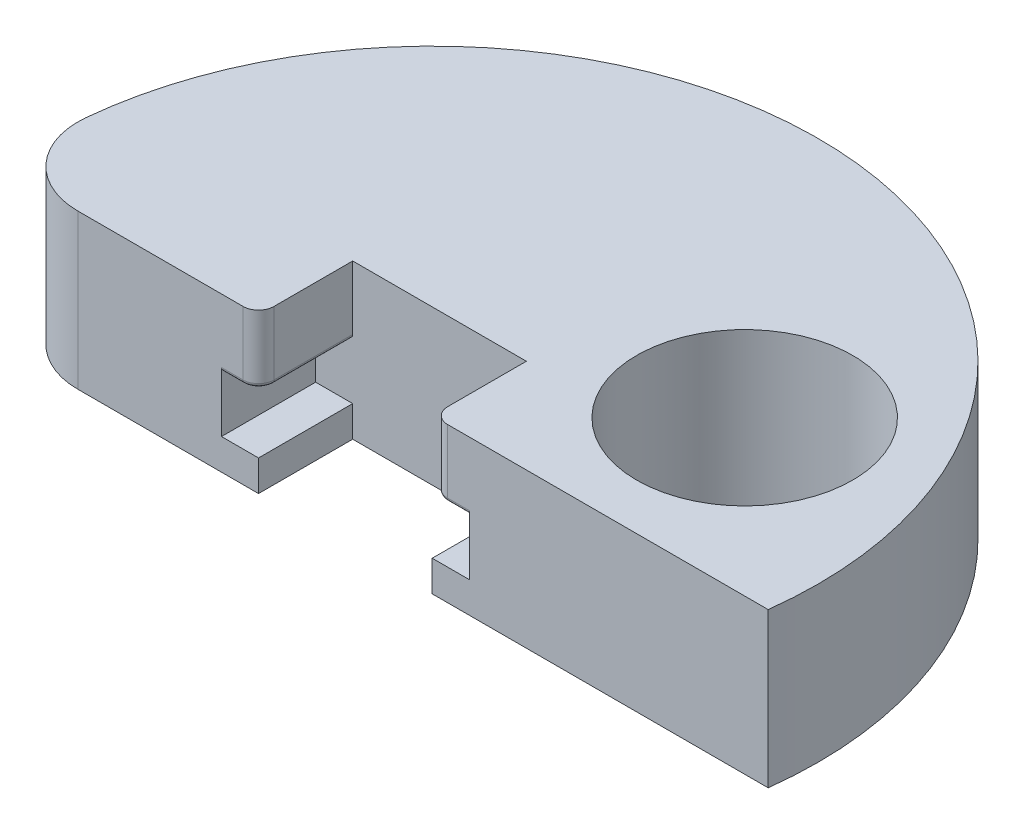
ISO-10303-21;
HEADER;
FILE_DESCRIPTION(('STEP AP214'),'2;1');
FILE_NAME('part.step','',(''),(''),'','','');
FILE_SCHEMA(('AUTOMOTIVE_DESIGN { 1 0 10303 214 1 1 1 1 }'));
ENDSEC;
DATA;
#1=APPLICATION_CONTEXT('core data for automotive mechanical design processes');
#2=APPLICATION_PROTOCOL_DEFINITION('international standard','automotive_design',2000,#1);
#3=PRODUCT_CONTEXT('',#1,'mechanical');
#4=PRODUCT('Part','Part','',(#3));
#5=PRODUCT_RELATED_PRODUCT_CATEGORY('part','',(#4));
#6=PRODUCT_DEFINITION_FORMATION('','',#4);
#7=PRODUCT_DEFINITION_CONTEXT('part definition',#1,'design');
#8=PRODUCT_DEFINITION('design','',#6,#7);
#9=PRODUCT_DEFINITION_SHAPE('','',#8);
#10=(LENGTH_UNIT() NAMED_UNIT(*) SI_UNIT(.MILLI.,.METRE.));
#11=(NAMED_UNIT(*) PLANE_ANGLE_UNIT() SI_UNIT($,.RADIAN.));
#12=(NAMED_UNIT(*) SI_UNIT($,.STERADIAN.) SOLID_ANGLE_UNIT());
#13=UNCERTAINTY_MEASURE_WITH_UNIT(LENGTH_MEASURE(1.E-05),#10,'distance_accuracy_value','');
#14=(GEOMETRIC_REPRESENTATION_CONTEXT(3) GLOBAL_UNCERTAINTY_ASSIGNED_CONTEXT((#13)) GLOBAL_UNIT_ASSIGNED_CONTEXT((#10,
#11,#12)) REPRESENTATION_CONTEXT('',''));
#15=CARTESIAN_POINT('',(0.,0.,0.));
#16=DIRECTION('',(0.,0.,1.));
#17=DIRECTION('',(1.,0.,0.));
#18=AXIS2_PLACEMENT_3D('',#15,#16,#17);
#19=CARTESIAN_POINT('',(-21.2,20.,6.09999999999998));
#20=DIRECTION('',(0.,0.,-1.));
#21=DIRECTION('',(-1.,0.,0.));
#22=AXIS2_PLACEMENT_3D('',#19,#20,#21);
#23=PLANE('',#22);
#24=DIRECTION('',(0.,-1.,0.));
#25=VECTOR('',#24,1.);
#26=CARTESIAN_POINT('',(8.1,20.,6.09999999999998));
#27=LINE('',#26,#25);
#28=CARTESIAN_POINT('',(8.1,20.,6.09999999999998));
#29=VERTEX_POINT('',#28);
#30=CARTESIAN_POINT('',(8.1,11.75,6.09999999999998));
#31=VERTEX_POINT('',#30);
#32=EDGE_CURVE('E354',#29,#31,#27,.T.);
#33=ORIENTED_EDGE('',*,*,#32,.T.);
#34=DIRECTION('',(-1.,0.,0.));
#35=VECTOR('',#34,1.);
#36=CARTESIAN_POINT('',(10.9,11.75,6.09999999999998));
#37=LINE('',#36,#35);
#38=CARTESIAN_POINT('',(10.9,11.75,6.09999999999998));
#39=VERTEX_POINT('',#38);
#40=EDGE_CURVE('E386',#31,#39,#37,.F.);
#41=ORIENTED_EDGE('',*,*,#40,.T.);
#42=DIRECTION('',(0.,-1.,0.));
#43=VECTOR('',#42,1.);
#44=CARTESIAN_POINT('',(10.9,11.25,6.09999999999998));
#45=LINE('',#44,#43);
#46=CARTESIAN_POINT('',(10.9,4.,6.09999999999998));
#47=VERTEX_POINT('',#46);
#48=EDGE_CURVE('E209',#39,#47,#45,.T.);
#49=ORIENTED_EDGE('',*,*,#48,.T.);
#50=DIRECTION('',(-1.,0.,0.));
#51=VECTOR('',#50,1.);
#52=CARTESIAN_POINT('',(6.1,4.,6.09999999999998));
#53=LINE('',#52,#51);
#54=CARTESIAN_POINT('',(6.1,4.,6.09999999999998));
#55=VERTEX_POINT('',#54);
#56=EDGE_CURVE('E203',#47,#55,#53,.T.);
#57=ORIENTED_EDGE('',*,*,#56,.T.);
#58=DIRECTION('',(0.,-1.,0.));
#59=VECTOR('',#58,1.);
#60=CARTESIAN_POINT('',(6.1,4.,6.09999999999998));
#61=LINE('',#60,#59);
#62=CARTESIAN_POINT('',(6.1,0.,6.09999999999998));
#63=VERTEX_POINT('',#62);
#64=EDGE_CURVE('E185',#55,#63,#61,.T.);
#65=ORIENTED_EDGE('',*,*,#64,.T.);
#66=DIRECTION('',(1.,0.,0.));
#67=VECTOR('',#66,1.);
#68=CARTESIAN_POINT('',(10.9,0.,6.09999999999998));
#69=LINE('',#68,#67);
#70=CARTESIAN_POINT('',(49.6265050149615,0.,6.09999999999998));
#71=VERTEX_POINT('',#70);
#72=EDGE_CURVE('E261',#63,#71,#69,.T.);
#73=ORIENTED_EDGE('',*,*,#72,.T.);
#74=DIRECTION('',(0.,-1.,0.));
#75=VECTOR('',#74,1.);
#76=CARTESIAN_POINT('',(49.6265050149615,20.,6.09999999999998));
#77=LINE('',#76,#75);
#78=CARTESIAN_POINT('',(49.6265050149615,20.,6.09999999999998));
#79=VERTEX_POINT('',#78);
#80=EDGE_CURVE('E260',#79,#71,#77,.T.);
#81=ORIENTED_EDGE('',*,*,#80,.F.);
#82=DIRECTION('',(1.,0.,0.));
#83=VECTOR('',#82,1.);
#84=CARTESIAN_POINT('',(-21.2,20.,6.09999999999998));
#85=LINE('',#84,#83);
#86=EDGE_CURVE('E327',#29,#79,#85,.T.);
#87=ORIENTED_EDGE('',*,*,#86,.F.);
#88=EDGE_LOOP('',(#33,#41,#49,#57,#65,#73,#81,#87));
#89=FACE_BOUND('',#88,.T.);
#90=ADVANCED_FACE('F40',(#89),#23,.F.);
#91=CARTESIAN_POINT('',(6.1,20.,6.09999999999997));
#92=DIRECTION('',(1.,0.,0.));
#93=DIRECTION('',(0.,0.,-1.));
#94=AXIS2_PLACEMENT_3D('',#91,#92,#93);
#95=PLANE('',#94);
#96=DIRECTION('',(0.,-1.,0.));
#97=VECTOR('',#96,1.);
#98=CARTESIAN_POINT('',(6.1,20.,-6.10000000000003));
#99=LINE('',#98,#97);
#100=CARTESIAN_POINT('',(6.1,20.,-6.10000000000003));
#101=VERTEX_POINT('',#100);
#102=CARTESIAN_POINT('',(6.1,11.75,-6.10000000000003));
#103=VERTEX_POINT('',#102);
#104=EDGE_CURVE('E323',#101,#103,#99,.T.);
#105=ORIENTED_EDGE('',*,*,#104,.T.);
#106=DIRECTION('',(0.,0.,-1.));
#107=VECTOR('',#106,1.);
#108=CARTESIAN_POINT('',(6.1,11.75,4.09999999999998));
#109=LINE('',#108,#107);
#110=CARTESIAN_POINT('',(6.1,11.75,4.09999999999998));
#111=VERTEX_POINT('',#110);
#112=EDGE_CURVE('E395',#103,#111,#109,.F.);
#113=ORIENTED_EDGE('',*,*,#112,.T.);
#114=DIRECTION('',(0.,-1.,0.));
#115=VECTOR('',#114,1.);
#116=CARTESIAN_POINT('',(6.1,20.,4.09999999999998));
#117=LINE('',#116,#115);
#118=CARTESIAN_POINT('',(6.1,20.,4.09999999999998));
#119=VERTEX_POINT('',#118);
#120=EDGE_CURVE('E357',#111,#119,#117,.F.);
#121=ORIENTED_EDGE('',*,*,#120,.T.);
#122=DIRECTION('',(0.,0.,1.));
#123=VECTOR('',#122,1.);
#124=CARTESIAN_POINT('',(6.1,20.,6.09999999999997));
#125=LINE('',#124,#123);
#126=EDGE_CURVE('E316',#101,#119,#125,.T.);
#127=ORIENTED_EDGE('',*,*,#126,.F.);
#128=EDGE_LOOP('',(#105,#113,#121,#127));
#129=FACE_BOUND('',#128,.T.);
#130=ADVANCED_FACE('F453',(#129),#95,.F.);
#131=CARTESIAN_POINT('',(-39.8094209955382,20.,6.09999999999998));
#132=VERTEX_POINT('',#131);
#133=CARTESIAN_POINT('',(-18.4,20.,6.09999999999998));
#134=VERTEX_POINT('',#133);
#135=EDGE_CURVE('E331',#132,#134,#85,.T.);
#136=ORIENTED_EDGE('',*,*,#135,.F.);
#137=DIRECTION('',(0.,-1.,0.));
#138=VECTOR('',#137,1.);
#139=CARTESIAN_POINT('',(-39.8094209955382,20.,6.09999999999998));
#140=LINE('',#139,#138);
#141=CARTESIAN_POINT('',(-39.8094209955382,0.,6.09999999999998));
#142=VERTEX_POINT('',#141);
#143=EDGE_CURVE('E411',#132,#142,#140,.T.);
#144=ORIENTED_EDGE('',*,*,#143,.T.);
#145=CARTESIAN_POINT('',(-16.4,0.,6.09999999999998));
#146=VERTEX_POINT('',#145);
#147=EDGE_CURVE('E257',#142,#146,#69,.T.);
#148=ORIENTED_EDGE('',*,*,#147,.T.);
#149=DIRECTION('',(0.,-1.,0.));
#150=VECTOR('',#149,1.);
#151=CARTESIAN_POINT('',(-16.4,4.,6.09999999999998));
#152=LINE('',#151,#150);
#153=CARTESIAN_POINT('',(-16.4,4.,6.09999999999998));
#154=VERTEX_POINT('',#153);
#155=EDGE_CURVE('E241',#154,#146,#152,.T.);
#156=ORIENTED_EDGE('',*,*,#155,.F.);
#157=DIRECTION('',(-1.,0.,0.));
#158=VECTOR('',#157,1.);
#159=CARTESIAN_POINT('',(-21.2,4.,6.09999999999996));
#160=LINE('',#159,#158);
#161=CARTESIAN_POINT('',(-21.2,4.,6.09999999999998));
#162=VERTEX_POINT('',#161);
#163=EDGE_CURVE('E233',#154,#162,#160,.T.);
#164=ORIENTED_EDGE('',*,*,#163,.T.);
#165=DIRECTION('',(0.,-1.,0.));
#166=VECTOR('',#165,1.);
#167=CARTESIAN_POINT('',(-21.2,20.,6.09999999999998));
#168=LINE('',#167,#166);
#169=CARTESIAN_POINT('',(-21.2,11.75,6.09999999999998));
#170=VERTEX_POINT('',#169);
#171=EDGE_CURVE('E265',#170,#162,#168,.T.);
#172=ORIENTED_EDGE('',*,*,#171,.F.);
#173=DIRECTION('',(-1.,0.,0.));
#174=VECTOR('',#173,1.);
#175=CARTESIAN_POINT('',(-21.2,11.75,6.09999999999998));
#176=LINE('',#175,#174);
#177=CARTESIAN_POINT('',(-18.4,11.75,6.09999999999998));
#178=VERTEX_POINT('',#177);
#179=EDGE_CURVE('E370',#170,#178,#176,.F.);
#180=ORIENTED_EDGE('',*,*,#179,.T.);
#181=DIRECTION('',(0.,-1.,0.));
#182=VECTOR('',#181,1.);
#183=CARTESIAN_POINT('',(-18.4,20.,6.09999999999998));
#184=LINE('',#183,#182);
#185=EDGE_CURVE('E344',#178,#134,#184,.F.);
#186=ORIENTED_EDGE('',*,*,#185,.T.);
#187=EDGE_LOOP('',(#136,#144,#148,#156,#164,#172,#180,#186));
#188=FACE_BOUND('',#187,.T.);
#189=ADVANCED_FACE('F455',(#188),#23,.F.);
#190=CARTESIAN_POINT('',(0.,20.,0.));
#191=DIRECTION('',(0.,-1.,0.));
#192=DIRECTION('',(0.,0.,-1.));
#193=AXIS2_PLACEMENT_3D('',#190,#191,#192);
#194=CYLINDRICAL_SURFACE('',#193,50.);
#195=CARTESIAN_POINT('',(0.,0.,0.));
#196=DIRECTION('',(0.,1.,0.));
#197=DIRECTION('',(0.,0.,1.));
#198=AXIS2_PLACEMENT_3D('',#195,#196,#197);
#199=CIRCLE('',#198,50.);
#200=CARTESIAN_POINT('',(-49.7617762444228,0.,-4.87500000000003));
#201=VERTEX_POINT('',#200);
#202=EDGE_CURVE('E334',#71,#201,#199,.T.);
#203=ORIENTED_EDGE('',*,*,#202,.T.);
#204=DIRECTION('',(0.,-1.,0.));
#205=VECTOR('',#204,1.);
#206=CARTESIAN_POINT('',(-49.7617762444228,20.,-4.87500000000003));
#207=LINE('',#206,#205);
#208=CARTESIAN_POINT('',(-49.7617762444228,20.,-4.87500000000003));
#209=VERTEX_POINT('',#208);
#210=EDGE_CURVE('E49',#201,#209,#207,.F.);
#211=ORIENTED_EDGE('',*,*,#210,.T.);
#212=CARTESIAN_POINT('',(0.,20.,0.));
#213=DIRECTION('',(0.,1.,0.));
#214=DIRECTION('',(0.,0.,1.));
#215=AXIS2_PLACEMENT_3D('',#212,#213,#214);
#216=CIRCLE('',#215,50.);
#217=EDGE_CURVE('E335',#79,#209,#216,.T.);
#218=ORIENTED_EDGE('',*,*,#217,.F.);
#219=ORIENTED_EDGE('',*,*,#80,.T.);
#220=EDGE_LOOP('',(#203,#211,#218,#219));
#221=FACE_BOUND('',#220,.T.);
#222=ADVANCED_FACE('F435',(#221),#194,.T.);
#223=CARTESIAN_POINT('',(0.,20.,0.));
#224=DIRECTION('',(0.,1.,0.));
#225=DIRECTION('',(0.,0.,1.));
#226=AXIS2_PLACEMENT_3D('',#223,#224,#225);
#227=PLANE('',#226);
#228=CARTESIAN_POINT('',(26.5855223759098,20.,-13.9));
#229=DIRECTION('',(0.,1.,0.));
#230=DIRECTION('',(0.,0.,1.));
#231=AXIS2_PLACEMENT_3D('',#228,#229,#230);
#232=CIRCLE('',#231,14.);
#233=CARTESIAN_POINT('',(26.5855223759098,20.,0.0999999999999873));
#234=VERTEX_POINT('',#233);
#235=EDGE_CURVE('E245',#234,#234,#232,.T.);
#236=ORIENTED_EDGE('',*,*,#235,.F.);
#237=EDGE_LOOP('',(#236));
#238=FACE_BOUND('',#237,.T.);
#239=ORIENTED_EDGE('',*,*,#217,.T.);
#240=CARTESIAN_POINT('',(-39.8094209955382,20.,-3.90000000000002));
#241=DIRECTION('',(0.,1.,0.));
#242=DIRECTION('',(0.,0.,1.));
#243=AXIS2_PLACEMENT_3D('',#240,#241,#242);
#244=CIRCLE('',#243,10.);
#245=EDGE_CURVE('E11',#209,#132,#244,.T.);
#246=ORIENTED_EDGE('',*,*,#245,.T.);
#247=ORIENTED_EDGE('',*,*,#135,.T.);
#248=CARTESIAN_POINT('',(-18.4,20.,4.09999999999998));
#249=DIRECTION('',(0.,1.,0.));
#250=DIRECTION('',(0.,0.,1.));
#251=AXIS2_PLACEMENT_3D('',#248,#249,#250);
#252=CIRCLE('',#251,2.);
#253=CARTESIAN_POINT('',(-16.4,20.,4.09999999999998));
#254=VERTEX_POINT('',#253);
#255=EDGE_CURVE('E351',#134,#254,#252,.T.);
#256=ORIENTED_EDGE('',*,*,#255,.T.);
#257=DIRECTION('',(0.,0.,-1.));
#258=VECTOR('',#257,1.);
#259=CARTESIAN_POINT('',(-16.4,20.,6.09999999999997));
#260=LINE('',#259,#258);
#261=CARTESIAN_POINT('',(-16.4,20.,-6.10000000000003));
#262=VERTEX_POINT('',#261);
#263=EDGE_CURVE('E309',#254,#262,#260,.T.);
#264=ORIENTED_EDGE('',*,*,#263,.T.);
#265=DIRECTION('',(1.,0.,0.));
#266=VECTOR('',#265,1.);
#267=CARTESIAN_POINT('',(6.1,20.,-6.10000000000003));
#268=LINE('',#267,#266);
#269=EDGE_CURVE('E312',#262,#101,#268,.T.);
#270=ORIENTED_EDGE('',*,*,#269,.T.);
#271=ORIENTED_EDGE('',*,*,#126,.T.);
#272=CARTESIAN_POINT('',(8.1,20.,4.09999999999998));
#273=DIRECTION('',(0.,1.,0.));
#274=DIRECTION('',(0.,0.,1.));
#275=AXIS2_PLACEMENT_3D('',#272,#273,#274);
#276=CIRCLE('',#275,2.);
#277=EDGE_CURVE('E348',#119,#29,#276,.T.);
#278=ORIENTED_EDGE('',*,*,#277,.T.);
#279=ORIENTED_EDGE('',*,*,#86,.T.);
#280=EDGE_LOOP('',(#239,#246,#247,#256,#264,#270,#271,#278,#279));
#281=FACE_BOUND('',#280,.T.);
#282=ADVANCED_FACE('F439',(#238,#281),#227,.T.);
#283=CARTESIAN_POINT('',(0.,0.,0.));
#284=DIRECTION('',(0.,1.,0.));
#285=DIRECTION('',(0.,0.,1.));
#286=AXIS2_PLACEMENT_3D('',#283,#284,#285);
#287=PLANE('',#286);
#288=CARTESIAN_POINT('',(26.5855223759098,0.,-13.9));
#289=DIRECTION('',(0.,1.,0.));
#290=DIRECTION('',(0.,0.,1.));
#291=AXIS2_PLACEMENT_3D('',#288,#289,#290);
#292=CIRCLE('',#291,14.);
#293=CARTESIAN_POINT('',(26.5855223759098,0.,0.0999999999999873));
#294=VERTEX_POINT('',#293);
#295=EDGE_CURVE('E249',#294,#294,#292,.T.);
#296=ORIENTED_EDGE('',*,*,#295,.T.);
#297=EDGE_LOOP('',(#296));
#298=FACE_BOUND('',#297,.T.);
#299=ORIENTED_EDGE('',*,*,#147,.F.);
#300=CARTESIAN_POINT('',(-39.8094209955382,0.,-3.90000000000002));
#301=DIRECTION('',(0.,1.,0.));
#302=DIRECTION('',(0.,0.,1.));
#303=AXIS2_PLACEMENT_3D('',#300,#301,#302);
#304=CIRCLE('',#303,10.);
#305=EDGE_CURVE('E63',#142,#201,#304,.F.);
#306=ORIENTED_EDGE('',*,*,#305,.T.);
#307=ORIENTED_EDGE('',*,*,#202,.F.);
#308=ORIENTED_EDGE('',*,*,#72,.F.);
#309=DIRECTION('',(0.,0.,-1.));
#310=VECTOR('',#309,1.);
#311=CARTESIAN_POINT('',(6.1,0.,-6.10000000000002));
#312=LINE('',#311,#310);
#313=CARTESIAN_POINT('',(6.1,0.,-6.10000000000003));
#314=VERTEX_POINT('',#313);
#315=EDGE_CURVE('E192',#63,#314,#312,.T.);
#316=ORIENTED_EDGE('',*,*,#315,.T.);
#317=DIRECTION('',(1.,0.,0.));
#318=VECTOR('',#317,1.);
#319=CARTESIAN_POINT('',(6.1,0.,-6.10000000000003));
#320=LINE('',#319,#318);
#321=CARTESIAN_POINT('',(-16.4,0.,-6.10000000000002));
#322=VERTEX_POINT('',#321);
#323=EDGE_CURVE('E296',#322,#314,#320,.T.);
#324=ORIENTED_EDGE('',*,*,#323,.F.);
#325=DIRECTION('',(0.,0.,1.));
#326=VECTOR('',#325,1.);
#327=CARTESIAN_POINT('',(-16.4,0.,6.09999999999998));
#328=LINE('',#327,#326);
#329=EDGE_CURVE('E221',#322,#146,#328,.T.);
#330=ORIENTED_EDGE('',*,*,#329,.T.);
#331=EDGE_LOOP('',(#299,#306,#307,#308,#316,#324,#330));
#332=FACE_BOUND('',#331,.T.);
#333=ADVANCED_FACE('F436',(#298,#332),#287,.F.);
#334=CARTESIAN_POINT('',(-21.2,20.,6.09999999999998));
#335=DIRECTION('',(-1.,0.,0.));
#336=DIRECTION('',(0.,0.,1.));
#337=AXIS2_PLACEMENT_3D('',#334,#335,#336);
#338=PLANE('',#337);
#339=ORIENTED_EDGE('',*,*,#171,.T.);
#340=DIRECTION('',(0.,0.,-1.));
#341=VECTOR('',#340,1.);
#342=CARTESIAN_POINT('',(-21.2,4.,-6.10000000000002));
#343=LINE('',#342,#341);
#344=CARTESIAN_POINT('',(-21.2,4.,-6.10000000000002));
#345=VERTEX_POINT('',#344);
#346=EDGE_CURVE('E223',#162,#345,#343,.T.);
#347=ORIENTED_EDGE('',*,*,#346,.T.);
#348=DIRECTION('',(0.,-1.,0.));
#349=VECTOR('',#348,1.);
#350=CARTESIAN_POINT('',(-21.2,11.25,-6.10000000000002));
#351=LINE('',#350,#349);
#352=CARTESIAN_POINT('',(-21.2,11.25,-6.10000000000002));
#353=VERTEX_POINT('',#352);
#354=EDGE_CURVE('E292',#353,#345,#351,.T.);
#355=ORIENTED_EDGE('',*,*,#354,.F.);
#356=DIRECTION('',(0.,0.,-1.));
#357=VECTOR('',#356,1.);
#358=CARTESIAN_POINT('',(-21.2,11.25,6.09999999999998));
#359=LINE('',#358,#357);
#360=CARTESIAN_POINT('',(-21.2,11.25,5.59999999999998));
#361=VERTEX_POINT('',#360);
#362=EDGE_CURVE('E285',#361,#353,#359,.T.);
#363=ORIENTED_EDGE('',*,*,#362,.F.);
#364=CARTESIAN_POINT('',(-21.2,11.75,5.59999999999998));
#365=DIRECTION('',(-1.,0.,0.));
#366=DIRECTION('',(0.,0.,1.));
#367=AXIS2_PLACEMENT_3D('',#364,#365,#366);
#368=CIRCLE('',#367,0.5);
#369=EDGE_CURVE('E398',#361,#170,#368,.T.);
#370=ORIENTED_EDGE('',*,*,#369,.T.);
#371=EDGE_LOOP('',(#339,#347,#355,#363,#370));
#372=FACE_BOUND('',#371,.T.);
#373=ADVANCED_FACE('F438',(#372),#338,.F.);
#374=CARTESIAN_POINT('',(-16.4,20.,6.09999999999997));
#375=DIRECTION('',(-1.,0.,0.));
#376=DIRECTION('',(0.,0.,1.));
#377=AXIS2_PLACEMENT_3D('',#374,#375,#376);
#378=PLANE('',#377);
#379=DIRECTION('',(0.,-1.,0.));
#380=VECTOR('',#379,1.);
#381=CARTESIAN_POINT('',(-16.4,20.,4.09999999999998));
#382=LINE('',#381,#380);
#383=CARTESIAN_POINT('',(-16.4,11.75,4.09999999999998));
#384=VERTEX_POINT('',#383);
#385=EDGE_CURVE('E338',#254,#384,#382,.T.);
#386=ORIENTED_EDGE('',*,*,#385,.T.);
#387=DIRECTION('',(0.,0.,1.));
#388=VECTOR('',#387,1.);
#389=CARTESIAN_POINT('',(-16.4,11.75,6.09999999999997));
#390=LINE('',#389,#388);
#391=CARTESIAN_POINT('',(-16.4,11.75,-6.10000000000003));
#392=VERTEX_POINT('',#391);
#393=EDGE_CURVE('E392',#384,#392,#390,.F.);
#394=ORIENTED_EDGE('',*,*,#393,.T.);
#395=DIRECTION('',(0.,-1.,0.));
#396=VECTOR('',#395,1.);
#397=CARTESIAN_POINT('',(-16.4,20.,-6.10000000000003));
#398=LINE('',#397,#396);
#399=EDGE_CURVE('E320',#262,#392,#398,.T.);
#400=ORIENTED_EDGE('',*,*,#399,.F.);
#401=ORIENTED_EDGE('',*,*,#263,.F.);
#402=EDGE_LOOP('',(#386,#394,#400,#401));
#403=FACE_BOUND('',#402,.T.);
#404=ADVANCED_FACE('F446',(#403),#378,.F.);
#405=CARTESIAN_POINT('',(6.1,20.,-6.10000000000003));
#406=DIRECTION('',(0.,0.,-1.));
#407=DIRECTION('',(-1.,0.,0.));
#408=AXIS2_PLACEMENT_3D('',#405,#406,#407);
#409=PLANE('',#408);
#410=ORIENTED_EDGE('',*,*,#323,.T.);
#411=DIRECTION('',(0.,-1.,0.));
#412=VECTOR('',#411,1.);
#413=CARTESIAN_POINT('',(6.1,4.,-6.10000000000002));
#414=LINE('',#413,#412);
#415=CARTESIAN_POINT('',(6.1,4.,-6.10000000000003));
#416=VERTEX_POINT('',#415);
#417=EDGE_CURVE('E196',#416,#314,#414,.T.);
#418=ORIENTED_EDGE('',*,*,#417,.F.);
#419=DIRECTION('',(1.,0.,0.));
#420=VECTOR('',#419,1.);
#421=CARTESIAN_POINT('',(10.9,4.,-6.10000000000002));
#422=LINE('',#421,#420);
#423=CARTESIAN_POINT('',(10.9,4.,-6.10000000000002));
#424=VERTEX_POINT('',#423);
#425=EDGE_CURVE('E197',#416,#424,#422,.T.);
#426=ORIENTED_EDGE('',*,*,#425,.T.);
#427=DIRECTION('',(0.,-1.,0.));
#428=VECTOR('',#427,1.);
#429=CARTESIAN_POINT('',(10.9,11.25,-6.10000000000002));
#430=LINE('',#429,#428);
#431=CARTESIAN_POINT('',(10.9,11.25,-6.10000000000002));
#432=VERTEX_POINT('',#431);
#433=EDGE_CURVE('E303',#432,#424,#430,.T.);
#434=ORIENTED_EDGE('',*,*,#433,.F.);
#435=DIRECTION('',(1.,0.,0.));
#436=VECTOR('',#435,1.);
#437=CARTESIAN_POINT('',(6.1,11.25,-6.10000000000002));
#438=LINE('',#437,#436);
#439=CARTESIAN_POINT('',(6.6,11.25,-6.10000000000002));
#440=VERTEX_POINT('',#439);
#441=EDGE_CURVE('E273',#440,#432,#438,.T.);
#442=ORIENTED_EDGE('',*,*,#441,.F.);
#443=CARTESIAN_POINT('',(6.6,11.75,-6.10000000000003));
#444=DIRECTION('',(0.,0.,-1.));
#445=DIRECTION('',(-1.,0.,0.));
#446=AXIS2_PLACEMENT_3D('',#443,#444,#445);
#447=CIRCLE('',#446,0.5);
#448=EDGE_CURVE('E408',#440,#103,#447,.T.);
#449=ORIENTED_EDGE('',*,*,#448,.T.);
#450=ORIENTED_EDGE('',*,*,#104,.F.);
#451=ORIENTED_EDGE('',*,*,#269,.F.);
#452=ORIENTED_EDGE('',*,*,#399,.T.);
#453=CARTESIAN_POINT('',(-16.9,11.75,-6.10000000000003));
#454=DIRECTION('',(0.,0.,-1.));
#455=DIRECTION('',(-1.,0.,0.));
#456=AXIS2_PLACEMENT_3D('',#453,#454,#455);
#457=CIRCLE('',#456,0.5);
#458=CARTESIAN_POINT('',(-16.9,11.25,-6.10000000000003));
#459=VERTEX_POINT('',#458);
#460=EDGE_CURVE('E405',#392,#459,#457,.T.);
#461=ORIENTED_EDGE('',*,*,#460,.T.);
#462=DIRECTION('',(1.,0.,0.));
#463=VECTOR('',#462,1.);
#464=CARTESIAN_POINT('',(-16.4,11.25,-6.10000000000003));
#465=LINE('',#464,#463);
#466=EDGE_CURVE('E288',#353,#459,#465,.T.);
#467=ORIENTED_EDGE('',*,*,#466,.F.);
#468=ORIENTED_EDGE('',*,*,#354,.T.);
#469=DIRECTION('',(1.,0.,0.));
#470=VECTOR('',#469,1.);
#471=CARTESIAN_POINT('',(-21.2,4.,-6.10000000000002));
#472=LINE('',#471,#470);
#473=CARTESIAN_POINT('',(-16.4,4.,-6.10000000000003));
#474=VERTEX_POINT('',#473);
#475=EDGE_CURVE('E226',#345,#474,#472,.T.);
#476=ORIENTED_EDGE('',*,*,#475,.T.);
#477=DIRECTION('',(0.,-1.,0.));
#478=VECTOR('',#477,1.);
#479=CARTESIAN_POINT('',(-16.4,4.,-6.10000000000002));
#480=LINE('',#479,#478);
#481=EDGE_CURVE('E237',#474,#322,#480,.T.);
#482=ORIENTED_EDGE('',*,*,#481,.T.);
#483=EDGE_LOOP('',(#410,#418,#426,#434,#442,#449,#450,#451,#452,#461,#467,#468,#476,#482));
#484=FACE_BOUND('',#483,.T.);
#485=ADVANCED_FACE('F499',(#484),#409,.F.);
#486=CARTESIAN_POINT('',(10.9,11.25,-6.10000000000002));
#487=DIRECTION('',(1.,0.,0.));
#488=DIRECTION('',(0.,0.,-1.));
#489=AXIS2_PLACEMENT_3D('',#486,#487,#488);
#490=PLANE('',#489);
#491=ORIENTED_EDGE('',*,*,#433,.T.);
#492=DIRECTION('',(0.,0.,1.));
#493=VECTOR('',#492,1.);
#494=CARTESIAN_POINT('',(10.9,4.,6.09999999999998));
#495=LINE('',#494,#493);
#496=EDGE_CURVE('E211',#424,#47,#495,.T.);
#497=ORIENTED_EDGE('',*,*,#496,.T.);
#498=ORIENTED_EDGE('',*,*,#48,.F.);
#499=CARTESIAN_POINT('',(10.9,11.75,5.59999999999998));
#500=DIRECTION('',(1.,0.,0.));
#501=DIRECTION('',(0.,0.,-1.));
#502=AXIS2_PLACEMENT_3D('',#499,#500,#501);
#503=CIRCLE('',#502,0.5);
#504=CARTESIAN_POINT('',(10.9,11.25,5.59999999999998));
#505=VERTEX_POINT('',#504);
#506=EDGE_CURVE('E402',#39,#505,#503,.T.);
#507=ORIENTED_EDGE('',*,*,#506,.T.);
#508=DIRECTION('',(0.,0.,1.));
#509=VECTOR('',#508,1.);
#510=CARTESIAN_POINT('',(10.9,11.25,-6.10000000000002));
#511=LINE('',#510,#509);
#512=EDGE_CURVE('E299',#432,#505,#511,.T.);
#513=ORIENTED_EDGE('',*,*,#512,.F.);
#514=EDGE_LOOP('',(#491,#497,#498,#507,#513));
#515=FACE_BOUND('',#514,.T.);
#516=ADVANCED_FACE('F491',(#515),#490,.F.);
#517=CARTESIAN_POINT('',(0.,11.25,0.));
#518=DIRECTION('',(0.,-1.,0.));
#519=DIRECTION('',(0.,0.,-1.));
#520=AXIS2_PLACEMENT_3D('',#517,#518,#519);
#521=PLANE('',#520);
#522=CARTESIAN_POINT('',(8.75,11.25,0.));
#523=DIRECTION('',(0.,-1.,0.));
#524=DIRECTION('',(0.,0.,-1.));
#525=AXIS2_PLACEMENT_3D('',#522,#523,#524);
#526=CIRCLE('',#525,0.500000000000001);
#527=CARTESIAN_POINT('',(8.75,11.25,-0.499999999999994));
#528=VERTEX_POINT('',#527);
#529=EDGE_CURVE('E274',#528,#528,#526,.T.);
#530=ORIENTED_EDGE('',*,*,#529,.F.);
#531=EDGE_LOOP('',(#530));
#532=FACE_BOUND('',#531,.T.);
#533=ORIENTED_EDGE('',*,*,#512,.T.);
#534=DIRECTION('',(-1.,0.,0.));
#535=VECTOR('',#534,1.);
#536=CARTESIAN_POINT('',(8.1,11.25,5.59999999999998));
#537=LINE('',#536,#535);
#538=CARTESIAN_POINT('',(8.1,11.25,5.59999999999998));
#539=VERTEX_POINT('',#538);
#540=EDGE_CURVE('E382',#505,#539,#537,.T.);
#541=ORIENTED_EDGE('',*,*,#540,.T.);
#542=CARTESIAN_POINT('',(8.1,11.25,4.09999999999998));
#543=DIRECTION('',(0.,-1.,0.));
#544=DIRECTION('',(0.,0.,-1.));
#545=AXIS2_PLACEMENT_3D('',#542,#543,#544);
#546=CIRCLE('',#545,1.5);
#547=CARTESIAN_POINT('',(6.6,11.25,4.09999999999998));
#548=VERTEX_POINT('',#547);
#549=EDGE_CURVE('E379',#539,#548,#546,.T.);
#550=ORIENTED_EDGE('',*,*,#549,.T.);
#551=DIRECTION('',(0.,0.,-1.));
#552=VECTOR('',#551,1.);
#553=CARTESIAN_POINT('',(6.6,11.25,-6.10000000000003));
#554=LINE('',#553,#552);
#555=EDGE_CURVE('E376',#548,#440,#554,.T.);
#556=ORIENTED_EDGE('',*,*,#555,.T.);
#557=ORIENTED_EDGE('',*,*,#441,.T.);
#558=EDGE_LOOP('',(#533,#541,#550,#556,#557));
#559=FACE_BOUND('',#558,.T.);
#560=ADVANCED_FACE('F493',(#532,#559),#521,.T.);
#561=CARTESIAN_POINT('',(0.,11.25,0.));
#562=DIRECTION('',(0.,1.,0.));
#563=DIRECTION('',(0.,0.,1.));
#564=AXIS2_PLACEMENT_3D('',#561,#562,#563);
#565=PLANE('',#564);
#566=CARTESIAN_POINT('',(-19.05,11.25,0.));
#567=DIRECTION('',(0.,-1.,0.));
#568=DIRECTION('',(0.,0.,-1.));
#569=AXIS2_PLACEMENT_3D('',#566,#567,#568);
#570=CIRCLE('',#569,0.499999999999999);
#571=CARTESIAN_POINT('',(-19.05,11.25,-0.499999999999992));
#572=VERTEX_POINT('',#571);
#573=EDGE_CURVE('E268',#572,#572,#570,.T.);
#574=ORIENTED_EDGE('',*,*,#573,.F.);
#575=EDGE_LOOP('',(#574));
#576=FACE_BOUND('',#575,.T.);
#577=CARTESIAN_POINT('',(-18.4,11.25,4.09999999999998));
#578=DIRECTION('',(0.,1.,0.));
#579=DIRECTION('',(0.,0.,1.));
#580=AXIS2_PLACEMENT_3D('',#577,#578,#579);
#581=CIRCLE('',#580,1.5);
#582=CARTESIAN_POINT('',(-16.9,11.25,4.09999999999998));
#583=VERTEX_POINT('',#582);
#584=CARTESIAN_POINT('',(-18.4,11.25,5.59999999999998));
#585=VERTEX_POINT('',#584);
#586=EDGE_CURVE('E363',#583,#585,#581,.F.);
#587=ORIENTED_EDGE('',*,*,#586,.T.);
#588=DIRECTION('',(-1.,0.,0.));
#589=VECTOR('',#588,1.);
#590=CARTESIAN_POINT('',(0.,11.25,5.59999999999998));
#591=LINE('',#590,#589);
#592=EDGE_CURVE('E366',#585,#361,#591,.T.);
#593=ORIENTED_EDGE('',*,*,#592,.T.);
#594=ORIENTED_EDGE('',*,*,#362,.T.);
#595=ORIENTED_EDGE('',*,*,#466,.T.);
#596=DIRECTION('',(0.,0.,1.));
#597=VECTOR('',#596,1.);
#598=CARTESIAN_POINT('',(-16.9,11.25,0.));
#599=LINE('',#598,#597);
#600=EDGE_CURVE('E360',#459,#583,#599,.T.);
#601=ORIENTED_EDGE('',*,*,#600,.T.);
#602=EDGE_LOOP('',(#587,#593,#594,#595,#601));
#603=FACE_BOUND('',#602,.T.);
#604=ADVANCED_FACE('F516',(#576,#603),#565,.F.);
#605=CARTESIAN_POINT('',(-19.05,11.65,0.));
#606=DIRECTION('',(0.,-1.,0.));
#607=DIRECTION('',(0.,0.,-1.));
#608=AXIS2_PLACEMENT_3D('',#605,#606,#607);
#609=CYLINDRICAL_SURFACE('',#608,0.499999999999999);
#610=CARTESIAN_POINT('',(-19.05,11.65,0.));
#611=DIRECTION('',(0.,-1.,0.));
#612=DIRECTION('',(0.,0.,-1.));
#613=AXIS2_PLACEMENT_3D('',#610,#611,#612);
#614=CIRCLE('',#613,0.499999999999999);
#615=CARTESIAN_POINT('',(-19.05,11.65,-0.499999999999992));
#616=VERTEX_POINT('',#615);
#617=EDGE_CURVE('E278',#616,#616,#614,.T.);
#618=ORIENTED_EDGE('',*,*,#617,.F.);
#619=EDGE_LOOP('',(#618));
#620=FACE_BOUND('',#619,.T.);
#621=ORIENTED_EDGE('',*,*,#573,.T.);
#622=EDGE_LOOP('',(#621));
#623=FACE_BOUND('',#622,.T.);
#624=ADVANCED_FACE('F577',(#620,#623),#609,.F.);
#625=CARTESIAN_POINT('',(-19.05,11.65,0.));
#626=DIRECTION('',(0.,-1.,0.));
#627=DIRECTION('',(0.,0.,-1.));
#628=AXIS2_PLACEMENT_3D('',#625,#626,#627);
#629=PLANE('',#628);
#630=ORIENTED_EDGE('',*,*,#617,.T.);
#631=EDGE_LOOP('',(#630));
#632=FACE_BOUND('',#631,.T.);
#633=ADVANCED_FACE('F569',(#632),#629,.T.);
#634=CARTESIAN_POINT('',(8.75,11.65,0.));
#635=DIRECTION('',(0.,-1.,0.));
#636=DIRECTION('',(0.,0.,-1.));
#637=AXIS2_PLACEMENT_3D('',#634,#635,#636);
#638=CYLINDRICAL_SURFACE('',#637,0.500000000000001);
#639=CARTESIAN_POINT('',(8.75,11.65,0.));
#640=DIRECTION('',(0.,-1.,0.));
#641=DIRECTION('',(0.,0.,-1.));
#642=AXIS2_PLACEMENT_3D('',#639,#640,#641);
#643=CIRCLE('',#642,0.500000000000001);
#644=CARTESIAN_POINT('',(8.75,11.65,-0.499999999999994));
#645=VERTEX_POINT('',#644);
#646=EDGE_CURVE('E269',#645,#645,#643,.T.);
#647=ORIENTED_EDGE('',*,*,#646,.F.);
#648=EDGE_LOOP('',(#647));
#649=FACE_BOUND('',#648,.T.);
#650=ORIENTED_EDGE('',*,*,#529,.T.);
#651=EDGE_LOOP('',(#650));
#652=FACE_BOUND('',#651,.T.);
#653=ADVANCED_FACE('F563',(#649,#652),#638,.F.);
#654=CARTESIAN_POINT('',(8.75,11.65,0.));
#655=DIRECTION('',(0.,-1.,0.));
#656=DIRECTION('',(0.,0.,-1.));
#657=AXIS2_PLACEMENT_3D('',#654,#655,#656);
#658=PLANE('',#657);
#659=ORIENTED_EDGE('',*,*,#646,.T.);
#660=EDGE_LOOP('',(#659));
#661=FACE_BOUND('',#660,.T.);
#662=ADVANCED_FACE('F559',(#661),#658,.T.);
#663=CARTESIAN_POINT('',(-18.4,20.,4.09999999999998));
#664=DIRECTION('',(0.,-1.,0.));
#665=DIRECTION('',(0.,0.,-1.));
#666=AXIS2_PLACEMENT_3D('',#663,#664,#665);
#667=CYLINDRICAL_SURFACE('',#666,2.);
#668=ORIENTED_EDGE('',*,*,#185,.F.);
#669=CARTESIAN_POINT('',(-18.4,11.75,4.09999999999998));
#670=DIRECTION('',(0.,1.,0.));
#671=DIRECTION('',(0.,0.,1.));
#672=AXIS2_PLACEMENT_3D('',#669,#670,#671);
#673=CIRCLE('',#672,2.);
#674=EDGE_CURVE('E373',#178,#384,#673,.T.);
#675=ORIENTED_EDGE('',*,*,#674,.T.);
#676=ORIENTED_EDGE('',*,*,#385,.F.);
#677=ORIENTED_EDGE('',*,*,#255,.F.);
#678=EDGE_LOOP('',(#668,#675,#676,#677));
#679=FACE_BOUND('',#678,.T.);
#680=ADVANCED_FACE('F531',(#679),#667,.T.);
#681=CARTESIAN_POINT('',(8.1,20.,4.09999999999998));
#682=DIRECTION('',(0.,-1.,0.));
#683=DIRECTION('',(0.,0.,-1.));
#684=AXIS2_PLACEMENT_3D('',#681,#682,#683);
#685=CYLINDRICAL_SURFACE('',#684,2.);
#686=ORIENTED_EDGE('',*,*,#120,.F.);
#687=CARTESIAN_POINT('',(8.1,11.75,4.09999999999998));
#688=DIRECTION('',(0.,-1.,0.));
#689=DIRECTION('',(0.,0.,-1.));
#690=AXIS2_PLACEMENT_3D('',#687,#688,#689);
#691=CIRCLE('',#690,2.);
#692=EDGE_CURVE('E389',#111,#31,#691,.F.);
#693=ORIENTED_EDGE('',*,*,#692,.T.);
#694=ORIENTED_EDGE('',*,*,#32,.F.);
#695=ORIENTED_EDGE('',*,*,#277,.F.);
#696=EDGE_LOOP('',(#686,#693,#694,#695));
#697=FACE_BOUND('',#696,.T.);
#698=ADVANCED_FACE('F478',(#697),#685,.T.);
#699=CARTESIAN_POINT('',(-16.9,11.75,0.));
#700=DIRECTION('',(0.,0.,1.));
#701=DIRECTION('',(1.,0.,0.));
#702=AXIS2_PLACEMENT_3D('',#699,#700,#701);
#703=CYLINDRICAL_SURFACE('',#702,0.5);
#704=ORIENTED_EDGE('',*,*,#460,.F.);
#705=ORIENTED_EDGE('',*,*,#393,.F.);
#706=CARTESIAN_POINT('',(-16.9,11.75,4.09999999999998));
#707=DIRECTION('',(0.,0.,1.));
#708=DIRECTION('',(1.,0.,0.));
#709=AXIS2_PLACEMENT_3D('',#706,#707,#708);
#710=CIRCLE('',#709,0.5);
#711=EDGE_CURVE('E416',#583,#384,#710,.T.);
#712=ORIENTED_EDGE('',*,*,#711,.F.);
#713=ORIENTED_EDGE('',*,*,#600,.F.);
#714=EDGE_LOOP('',(#704,#705,#712,#713));
#715=FACE_BOUND('',#714,.T.);
#716=ADVANCED_FACE('F519',(#715),#703,.T.);
#717=CARTESIAN_POINT('',(-18.4,11.75,4.09999999999998));
#718=DIRECTION('',(0.,1.,0.));
#719=DIRECTION('',(0.,0.,1.));
#720=AXIS2_PLACEMENT_3D('',#717,#718,#719);
#721=TOROIDAL_SURFACE('',#720,1.5,0.5);
#722=ORIENTED_EDGE('',*,*,#711,.T.);
#723=ORIENTED_EDGE('',*,*,#674,.F.);
#724=CARTESIAN_POINT('',(-18.4,11.75,5.59999999999998));
#725=DIRECTION('',(-1.,0.,0.));
#726=DIRECTION('',(0.,0.,1.));
#727=AXIS2_PLACEMENT_3D('',#724,#725,#726);
#728=CIRCLE('',#727,0.5);
#729=EDGE_CURVE('E412',#585,#178,#728,.T.);
#730=ORIENTED_EDGE('',*,*,#729,.F.);
#731=ORIENTED_EDGE('',*,*,#586,.F.);
#732=EDGE_LOOP('',(#722,#723,#730,#731));
#733=FACE_BOUND('',#732,.T.);
#734=ADVANCED_FACE('F525',(#733),#721,.T.);
#735=CARTESIAN_POINT('',(0.,11.75,5.59999999999998));
#736=DIRECTION('',(-1.,0.,0.));
#737=DIRECTION('',(0.,0.,1.));
#738=AXIS2_PLACEMENT_3D('',#735,#736,#737);
#739=CYLINDRICAL_SURFACE('',#738,0.5);
#740=ORIENTED_EDGE('',*,*,#729,.T.);
#741=ORIENTED_EDGE('',*,*,#179,.F.);
#742=ORIENTED_EDGE('',*,*,#369,.F.);
#743=ORIENTED_EDGE('',*,*,#592,.F.);
#744=EDGE_LOOP('',(#740,#741,#742,#743));
#745=FACE_BOUND('',#744,.T.);
#746=ADVANCED_FACE('F529',(#745),#739,.T.);
#747=CARTESIAN_POINT('',(6.6,11.75,0.));
#748=DIRECTION('',(0.,0.,1.));
#749=DIRECTION('',(1.,0.,0.));
#750=AXIS2_PLACEMENT_3D('',#747,#748,#749);
#751=CYLINDRICAL_SURFACE('',#750,0.5);
#752=ORIENTED_EDGE('',*,*,#448,.F.);
#753=ORIENTED_EDGE('',*,*,#555,.F.);
#754=CARTESIAN_POINT('',(6.6,11.75,4.09999999999998));
#755=DIRECTION('',(0.,0.,1.));
#756=DIRECTION('',(1.,0.,0.));
#757=AXIS2_PLACEMENT_3D('',#754,#755,#756);
#758=CIRCLE('',#757,0.5);
#759=EDGE_CURVE('E417',#111,#548,#758,.T.);
#760=ORIENTED_EDGE('',*,*,#759,.F.);
#761=ORIENTED_EDGE('',*,*,#112,.F.);
#762=EDGE_LOOP('',(#752,#753,#760,#761));
#763=FACE_BOUND('',#762,.T.);
#764=ADVANCED_FACE('F540',(#763),#751,.T.);
#765=CARTESIAN_POINT('',(8.1,11.75,4.09999999999998));
#766=DIRECTION('',(0.,-1.,0.));
#767=DIRECTION('',(0.,0.,-1.));
#768=AXIS2_PLACEMENT_3D('',#765,#766,#767);
#769=TOROIDAL_SURFACE('',#768,1.5,0.5);
#770=ORIENTED_EDGE('',*,*,#759,.T.);
#771=ORIENTED_EDGE('',*,*,#549,.F.);
#772=CARTESIAN_POINT('',(8.1,11.75,5.59999999999998));
#773=DIRECTION('',(1.,0.,0.));
#774=DIRECTION('',(0.,0.,-1.));
#775=AXIS2_PLACEMENT_3D('',#772,#773,#774);
#776=CIRCLE('',#775,0.5);
#777=EDGE_CURVE('E253',#31,#539,#776,.T.);
#778=ORIENTED_EDGE('',*,*,#777,.F.);
#779=ORIENTED_EDGE('',*,*,#692,.F.);
#780=EDGE_LOOP('',(#770,#771,#778,#779));
#781=FACE_BOUND('',#780,.T.);
#782=ADVANCED_FACE('F483',(#781),#769,.T.);
#783=CARTESIAN_POINT('',(0.,11.75,5.59999999999998));
#784=DIRECTION('',(1.,0.,0.));
#785=DIRECTION('',(0.,0.,-1.));
#786=AXIS2_PLACEMENT_3D('',#783,#784,#785);
#787=CYLINDRICAL_SURFACE('',#786,0.5);
#788=ORIENTED_EDGE('',*,*,#506,.F.);
#789=ORIENTED_EDGE('',*,*,#40,.F.);
#790=ORIENTED_EDGE('',*,*,#777,.T.);
#791=ORIENTED_EDGE('',*,*,#540,.F.);
#792=EDGE_LOOP('',(#788,#789,#790,#791));
#793=FACE_BOUND('',#792,.T.);
#794=ADVANCED_FACE('F488',(#793),#787,.T.);
#795=CARTESIAN_POINT('',(26.5855223759098,0.,-13.9));
#796=DIRECTION('',(0.,1.,0.));
#797=DIRECTION('',(0.,0.,1.));
#798=AXIS2_PLACEMENT_3D('',#795,#796,#797);
#799=CYLINDRICAL_SURFACE('',#798,14.);
#800=ORIENTED_EDGE('',*,*,#295,.F.);
#801=EDGE_LOOP('',(#800));
#802=FACE_BOUND('',#801,.T.);
#803=ORIENTED_EDGE('',*,*,#235,.T.);
#804=EDGE_LOOP('',(#803));
#805=FACE_BOUND('',#804,.T.);
#806=ADVANCED_FACE('F551',(#802,#805),#799,.F.);
#807=CARTESIAN_POINT('',(-16.4,4.,6.09999999999998));
#808=DIRECTION('',(1.,0.,0.));
#809=DIRECTION('',(0.,0.,-1.));
#810=AXIS2_PLACEMENT_3D('',#807,#808,#809);
#811=PLANE('',#810);
#812=ORIENTED_EDGE('',*,*,#329,.F.);
#813=ORIENTED_EDGE('',*,*,#481,.F.);
#814=DIRECTION('',(0.,0.,1.));
#815=VECTOR('',#814,1.);
#816=CARTESIAN_POINT('',(-16.4,4.,6.09999999999998));
#817=LINE('',#816,#815);
#818=EDGE_CURVE('E229',#474,#154,#817,.T.);
#819=ORIENTED_EDGE('',*,*,#818,.T.);
#820=ORIENTED_EDGE('',*,*,#155,.T.);
#821=EDGE_LOOP('',(#812,#813,#819,#820));
#822=FACE_BOUND('',#821,.T.);
#823=ADVANCED_FACE('F505',(#822),#811,.T.);
#824=CARTESIAN_POINT('',(0.,4.,0.));
#825=DIRECTION('',(0.,1.,0.));
#826=DIRECTION('',(0.,0.,1.));
#827=AXIS2_PLACEMENT_3D('',#824,#825,#826);
#828=PLANE('',#827);
#829=ORIENTED_EDGE('',*,*,#346,.F.);
#830=ORIENTED_EDGE('',*,*,#163,.F.);
#831=ORIENTED_EDGE('',*,*,#818,.F.);
#832=ORIENTED_EDGE('',*,*,#475,.F.);
#833=EDGE_LOOP('',(#829,#830,#831,#832));
#834=FACE_BOUND('',#833,.T.);
#835=ADVANCED_FACE('F509',(#834),#828,.T.);
#836=CARTESIAN_POINT('',(6.1,4.,-6.10000000000002));
#837=DIRECTION('',(-1.,0.,0.));
#838=DIRECTION('',(0.,0.,1.));
#839=AXIS2_PLACEMENT_3D('',#836,#837,#838);
#840=PLANE('',#839);
#841=ORIENTED_EDGE('',*,*,#315,.F.);
#842=ORIENTED_EDGE('',*,*,#64,.F.);
#843=DIRECTION('',(0.,0.,-1.));
#844=VECTOR('',#843,1.);
#845=CARTESIAN_POINT('',(6.1,4.,-6.10000000000002));
#846=LINE('',#845,#844);
#847=EDGE_CURVE('E189',#55,#416,#846,.T.);
#848=ORIENTED_EDGE('',*,*,#847,.T.);
#849=ORIENTED_EDGE('',*,*,#417,.T.);
#850=EDGE_LOOP('',(#841,#842,#848,#849));
#851=FACE_BOUND('',#850,.T.);
#852=ADVANCED_FACE('F187',(#851),#840,.T.);
#853=CARTESIAN_POINT('',(0.,4.,0.));
#854=DIRECTION('',(0.,1.,0.));
#855=DIRECTION('',(0.,0.,1.));
#856=AXIS2_PLACEMENT_3D('',#853,#854,#855);
#857=PLANE('',#856);
#858=ORIENTED_EDGE('',*,*,#496,.F.);
#859=ORIENTED_EDGE('',*,*,#425,.F.);
#860=ORIENTED_EDGE('',*,*,#847,.F.);
#861=ORIENTED_EDGE('',*,*,#56,.F.);
#862=EDGE_LOOP('',(#858,#859,#860,#861));
#863=FACE_BOUND('',#862,.T.);
#864=ADVANCED_FACE('F202',(#863),#857,.T.);
#865=CARTESIAN_POINT('',(-39.8094209955382,20.,-3.90000000000002));
#866=DIRECTION('',(0.,-1.,0.));
#867=DIRECTION('',(0.,0.,-1.));
#868=AXIS2_PLACEMENT_3D('',#865,#866,#867);
#869=CYLINDRICAL_SURFACE('',#868,10.);
#870=ORIENTED_EDGE('',*,*,#245,.F.);
#871=ORIENTED_EDGE('',*,*,#210,.F.);
#872=ORIENTED_EDGE('',*,*,#305,.F.);
#873=ORIENTED_EDGE('',*,*,#143,.F.);
#874=EDGE_LOOP('',(#870,#871,#872,#873));
#875=FACE_BOUND('',#874,.T.);
#876=ADVANCED_FACE('F42',(#875),#869,.T.);
#877=CLOSED_SHELL('',(#90,#130,#189,#222,#282,#333,#373,#404,#485,#516,#560,#604,#624,#633,#653,
#662,#680,#698,#716,#734,#746,#764,#782,#794,#806,#823,#835,#852,#864,#876));
#878=MANIFOLD_SOLID_BREP('B2',#877);
#879=ADVANCED_BREP_SHAPE_REPRESENTATION('',(#18,#878),#14);
#880=SHAPE_DEFINITION_REPRESENTATION(#9,#879);
ENDSEC;
END-ISO-10303-21;
